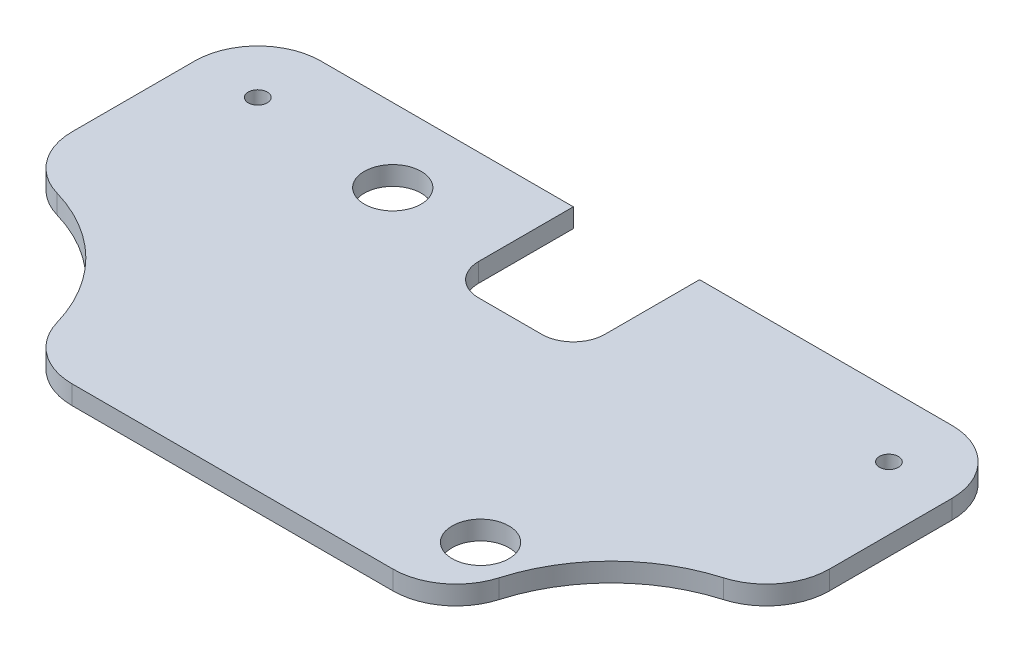
ISO-10303-21;
HEADER;
FILE_DESCRIPTION(('STEP AP214'),'2;1');
FILE_NAME('part.step','',(''),(''),'','','');
FILE_SCHEMA(('AUTOMOTIVE_DESIGN { 1 0 10303 214 1 1 1 1 }'));
ENDSEC;
DATA;
#1=APPLICATION_CONTEXT('core data for automotive mechanical design processes');
#2=APPLICATION_PROTOCOL_DEFINITION('international standard','automotive_design',2000,#1);
#3=PRODUCT_CONTEXT('',#1,'mechanical');
#4=PRODUCT('Part','Part','',(#3));
#5=PRODUCT_RELATED_PRODUCT_CATEGORY('part','',(#4));
#6=PRODUCT_DEFINITION_FORMATION('','',#4);
#7=PRODUCT_DEFINITION_CONTEXT('part definition',#1,'design');
#8=PRODUCT_DEFINITION('design','',#6,#7);
#9=PRODUCT_DEFINITION_SHAPE('','',#8);
#10=(LENGTH_UNIT() NAMED_UNIT(*) SI_UNIT(.MILLI.,.METRE.));
#11=(NAMED_UNIT(*) PLANE_ANGLE_UNIT() SI_UNIT($,.RADIAN.));
#12=(NAMED_UNIT(*) SI_UNIT($,.STERADIAN.) SOLID_ANGLE_UNIT());
#13=UNCERTAINTY_MEASURE_WITH_UNIT(LENGTH_MEASURE(1.E-05),#10,'distance_accuracy_value','');
#14=(GEOMETRIC_REPRESENTATION_CONTEXT(3) GLOBAL_UNCERTAINTY_ASSIGNED_CONTEXT((#13)) GLOBAL_UNIT_ASSIGNED_CONTEXT((#10,
#11,#12)) REPRESENTATION_CONTEXT('',''));
#15=CARTESIAN_POINT('',(0.,0.,0.));
#16=DIRECTION('',(0.,0.,1.));
#17=DIRECTION('',(1.,0.,0.));
#18=AXIS2_PLACEMENT_3D('',#15,#16,#17);
#19=CARTESIAN_POINT('',(-60.,3.,-32.));
#20=DIRECTION('',(0.,0.,1.));
#21=DIRECTION('',(1.,0.,0.));
#22=AXIS2_PLACEMENT_3D('',#19,#20,#21);
#23=PLANE('',#22);
#24=DIRECTION('',(-1.,0.,0.));
#25=VECTOR('',#24,1.);
#26=CARTESIAN_POINT('',(-60.,3.,-32.));
#27=LINE('',#26,#25);
#28=CARTESIAN_POINT('',(-9.99999999999999,3.,-32.));
#29=VERTEX_POINT('',#28);
#30=CARTESIAN_POINT('',(-50.,3.,-32.));
#31=VERTEX_POINT('',#30);
#32=EDGE_CURVE('E164',#29,#31,#27,.T.);
#33=ORIENTED_EDGE('',*,*,#32,.F.);
#34=DIRECTION('',(0.,-1.,0.));
#35=VECTOR('',#34,1.);
#36=CARTESIAN_POINT('',(-9.99999999999999,3.,-32.));
#37=LINE('',#36,#35);
#38=CARTESIAN_POINT('',(-9.99999999999999,0.,-32.));
#39=VERTEX_POINT('',#38);
#40=EDGE_CURVE('E176',#29,#39,#37,.T.);
#41=ORIENTED_EDGE('',*,*,#40,.T.);
#42=DIRECTION('',(-1.,0.,0.));
#43=VECTOR('',#42,1.);
#44=CARTESIAN_POINT('',(-60.,0.,-32.));
#45=LINE('',#44,#43);
#46=CARTESIAN_POINT('',(-50.,0.,-32.));
#47=VERTEX_POINT('',#46);
#48=EDGE_CURVE('E203',#39,#47,#45,.T.);
#49=ORIENTED_EDGE('',*,*,#48,.T.);
#50=DIRECTION('',(0.,-1.,0.));
#51=VECTOR('',#50,1.);
#52=CARTESIAN_POINT('',(-50.,3.,-32.));
#53=LINE('',#52,#51);
#54=EDGE_CURVE('E186',#47,#31,#53,.F.);
#55=ORIENTED_EDGE('',*,*,#54,.T.);
#56=EDGE_LOOP('',(#33,#41,#49,#55));
#57=FACE_BOUND('',#56,.T.);
#58=ADVANCED_FACE('F34',(#57),#23,.F.);
#59=CARTESIAN_POINT('',(60.,3.,32.));
#60=DIRECTION('',(-1.,0.,0.));
#61=DIRECTION('',(0.,0.,1.));
#62=AXIS2_PLACEMENT_3D('',#59,#60,#61);
#63=PLANE('',#62);
#64=DIRECTION('',(0.,0.,-1.));
#65=VECTOR('',#64,1.);
#66=CARTESIAN_POINT('',(60.,3.,32.));
#67=LINE('',#66,#65);
#68=CARTESIAN_POINT('',(60.,3.,-2.58323293158116));
#69=VERTEX_POINT('',#68);
#70=CARTESIAN_POINT('',(60.,3.,-22.));
#71=VERTEX_POINT('',#70);
#72=EDGE_CURVE('E189',#69,#71,#67,.T.);
#73=ORIENTED_EDGE('',*,*,#72,.F.);
#74=DIRECTION('',(0.,-1.,0.));
#75=VECTOR('',#74,1.);
#76=CARTESIAN_POINT('',(60.,3.,-2.58323293158116));
#77=LINE('',#76,#75);
#78=CARTESIAN_POINT('',(60.,0.,-2.58323293158116));
#79=VERTEX_POINT('',#78);
#80=EDGE_CURVE('E249',#69,#79,#77,.T.);
#81=ORIENTED_EDGE('',*,*,#80,.T.);
#82=DIRECTION('',(0.,0.,-1.));
#83=VECTOR('',#82,1.);
#84=CARTESIAN_POINT('',(60.,0.,32.));
#85=LINE('',#84,#83);
#86=CARTESIAN_POINT('',(60.,0.,-22.));
#87=VERTEX_POINT('',#86);
#88=EDGE_CURVE('E201',#79,#87,#85,.T.);
#89=ORIENTED_EDGE('',*,*,#88,.T.);
#90=DIRECTION('',(0.,-1.,0.));
#91=VECTOR('',#90,1.);
#92=CARTESIAN_POINT('',(60.,3.,-22.));
#93=LINE('',#92,#91);
#94=EDGE_CURVE('E223',#87,#71,#93,.F.);
#95=ORIENTED_EDGE('',*,*,#94,.T.);
#96=EDGE_LOOP('',(#73,#81,#89,#95));
#97=FACE_BOUND('',#96,.T.);
#98=ADVANCED_FACE('F342',(#97),#63,.F.);
#99=CARTESIAN_POINT('',(50.,0.,-32.));
#100=VERTEX_POINT('',#99);
#101=CARTESIAN_POINT('',(10.,0.,-32.));
#102=VERTEX_POINT('',#101);
#103=EDGE_CURVE('E205',#100,#102,#45,.T.);
#104=ORIENTED_EDGE('',*,*,#103,.T.);
#105=DIRECTION('',(0.,-1.,0.));
#106=VECTOR('',#105,1.);
#107=CARTESIAN_POINT('',(10.,3.,-32.));
#108=LINE('',#107,#106);
#109=CARTESIAN_POINT('',(10.,3.,-32.));
#110=VERTEX_POINT('',#109);
#111=EDGE_CURVE('E182',#110,#102,#108,.T.);
#112=ORIENTED_EDGE('',*,*,#111,.F.);
#113=CARTESIAN_POINT('',(50.,3.,-32.));
#114=VERTEX_POINT('',#113);
#115=EDGE_CURVE('E188',#114,#110,#27,.T.);
#116=ORIENTED_EDGE('',*,*,#115,.F.);
#117=DIRECTION('',(0.,-1.,0.));
#118=VECTOR('',#117,1.);
#119=CARTESIAN_POINT('',(50.,3.,-32.));
#120=LINE('',#119,#118);
#121=EDGE_CURVE('E214',#114,#100,#120,.T.);
#122=ORIENTED_EDGE('',*,*,#121,.T.);
#123=EDGE_LOOP('',(#104,#112,#116,#122));
#124=FACE_BOUND('',#123,.T.);
#125=ADVANCED_FACE('F344',(#124),#23,.F.);
#126=CARTESIAN_POINT('',(-60.,3.,32.));
#127=DIRECTION('',(1.,0.,0.));
#128=DIRECTION('',(0.,0.,-1.));
#129=AXIS2_PLACEMENT_3D('',#126,#127,#128);
#130=PLANE('',#129);
#131=DIRECTION('',(0.,0.,1.));
#132=VECTOR('',#131,1.);
#133=CARTESIAN_POINT('',(-60.,0.,32.));
#134=LINE('',#133,#132);
#135=CARTESIAN_POINT('',(-60.,0.,-22.));
#136=VERTEX_POINT('',#135);
#137=CARTESIAN_POINT('',(-60.,0.,-2.58323293158116));
#138=VERTEX_POINT('',#137);
#139=EDGE_CURVE('E208',#136,#138,#134,.T.);
#140=ORIENTED_EDGE('',*,*,#139,.T.);
#141=DIRECTION('',(0.,-1.,0.));
#142=VECTOR('',#141,1.);
#143=CARTESIAN_POINT('',(-60.,3.,-2.58323293158116));
#144=LINE('',#143,#142);
#145=CARTESIAN_POINT('',(-60.,3.,-2.58323293158116));
#146=VERTEX_POINT('',#145);
#147=EDGE_CURVE('E264',#138,#146,#144,.F.);
#148=ORIENTED_EDGE('',*,*,#147,.T.);
#149=DIRECTION('',(0.,0.,1.));
#150=VECTOR('',#149,1.);
#151=CARTESIAN_POINT('',(-60.,3.,32.));
#152=LINE('',#151,#150);
#153=CARTESIAN_POINT('',(-60.,3.,-22.));
#154=VERTEX_POINT('',#153);
#155=EDGE_CURVE('E192',#154,#146,#152,.T.);
#156=ORIENTED_EDGE('',*,*,#155,.F.);
#157=DIRECTION('',(0.,-1.,0.));
#158=VECTOR('',#157,1.);
#159=CARTESIAN_POINT('',(-60.,3.,-22.));
#160=LINE('',#159,#158);
#161=EDGE_CURVE('E230',#154,#136,#160,.T.);
#162=ORIENTED_EDGE('',*,*,#161,.T.);
#163=EDGE_LOOP('',(#140,#148,#156,#162));
#164=FACE_BOUND('',#163,.T.);
#165=ADVANCED_FACE('F336',(#164),#130,.F.);
#166=CARTESIAN_POINT('',(-60.,3.,32.));
#167=DIRECTION('',(0.,0.,-1.));
#168=DIRECTION('',(-1.,0.,0.));
#169=AXIS2_PLACEMENT_3D('',#166,#167,#168);
#170=PLANE('',#169);
#171=DIRECTION('',(1.,0.,0.));
#172=VECTOR('',#171,1.);
#173=CARTESIAN_POINT('',(-60.,0.,32.));
#174=LINE('',#173,#172);
#175=CARTESIAN_POINT('',(-25.4167670684188,0.,32.));
#176=VERTEX_POINT('',#175);
#177=CARTESIAN_POINT('',(25.4167670684188,0.,32.));
#178=VERTEX_POINT('',#177);
#179=EDGE_CURVE('E193',#176,#178,#174,.T.);
#180=ORIENTED_EDGE('',*,*,#179,.T.);
#181=DIRECTION('',(0.,-1.,0.));
#182=VECTOR('',#181,1.);
#183=CARTESIAN_POINT('',(25.4167670684188,3.,32.));
#184=LINE('',#183,#182);
#185=CARTESIAN_POINT('',(25.4167670684188,3.,32.));
#186=VERTEX_POINT('',#185);
#187=EDGE_CURVE('E272',#178,#186,#184,.F.);
#188=ORIENTED_EDGE('',*,*,#187,.T.);
#189=DIRECTION('',(1.,0.,0.));
#190=VECTOR('',#189,1.);
#191=CARTESIAN_POINT('',(-60.,3.,32.));
#192=LINE('',#191,#190);
#193=CARTESIAN_POINT('',(-25.4167670684188,3.,32.));
#194=VERTEX_POINT('',#193);
#195=EDGE_CURVE('E199',#194,#186,#192,.T.);
#196=ORIENTED_EDGE('',*,*,#195,.F.);
#197=DIRECTION('',(0.,-1.,0.));
#198=VECTOR('',#197,1.);
#199=CARTESIAN_POINT('',(-25.4167670684188,3.,32.));
#200=LINE('',#199,#198);
#201=EDGE_CURVE('E269',#194,#176,#200,.T.);
#202=ORIENTED_EDGE('',*,*,#201,.T.);
#203=EDGE_LOOP('',(#180,#188,#196,#202));
#204=FACE_BOUND('',#203,.T.);
#205=ADVANCED_FACE('F287',(#204),#170,.F.);
#206=CARTESIAN_POINT('',(0.,3.,0.));
#207=DIRECTION('',(0.,-1.,0.));
#208=DIRECTION('',(0.,0.,-1.));
#209=AXIS2_PLACEMENT_3D('',#206,#207,#208);
#210=PLANE('',#209);
#211=CARTESIAN_POINT('',(-26.921391454817,3.,-20.3095932567179));
#212=DIRECTION('',(0.,-1.,0.));
#213=DIRECTION('',(0.,0.,-1.));
#214=AXIS2_PLACEMENT_3D('',#211,#212,#213);
#215=CIRCLE('',#214,4.5);
#216=CARTESIAN_POINT('',(-26.921391454817,3.,-24.8095932567179));
#217=VERTEX_POINT('',#216);
#218=EDGE_CURVE('E299',#217,#217,#215,.T.);
#219=ORIENTED_EDGE('',*,*,#218,.T.);
#220=EDGE_LOOP('',(#219));
#221=FACE_BOUND('',#220,.T.);
#222=CARTESIAN_POINT('',(28.6833041627338,3.,21.3841451853975));
#223=DIRECTION('',(0.,-1.,0.));
#224=DIRECTION('',(0.,0.,-1.));
#225=AXIS2_PLACEMENT_3D('',#222,#223,#224);
#226=CIRCLE('',#225,4.5);
#227=CARTESIAN_POINT('',(28.6833041627338,3.,16.8841451853975));
#228=VERTEX_POINT('',#227);
#229=EDGE_CURVE('E398',#228,#228,#226,.T.);
#230=ORIENTED_EDGE('',*,*,#229,.T.);
#231=EDGE_LOOP('',(#230));
#232=FACE_BOUND('',#231,.T.);
#233=CARTESIAN_POINT('',(-50.,3.,-22.));
#234=DIRECTION('',(0.,1.,0.));
#235=DIRECTION('',(0.,0.,1.));
#236=AXIS2_PLACEMENT_3D('',#233,#234,#235);
#237=CIRCLE('',#236,1.5);
#238=CARTESIAN_POINT('',(-50.,3.,-20.5));
#239=VERTEX_POINT('',#238);
#240=EDGE_CURVE('E316',#239,#239,#237,.T.);
#241=ORIENTED_EDGE('',*,*,#240,.F.);
#242=EDGE_LOOP('',(#241));
#243=FACE_BOUND('',#242,.T.);
#244=CARTESIAN_POINT('',(50.,3.,-22.));
#245=DIRECTION('',(0.,1.,0.));
#246=DIRECTION('',(0.,0.,-1.));
#247=AXIS2_PLACEMENT_3D('',#244,#245,#246);
#248=CIRCLE('',#247,1.5);
#249=CARTESIAN_POINT('',(50.,3.,-23.5));
#250=VERTEX_POINT('',#249);
#251=EDGE_CURVE('E312',#250,#250,#248,.T.);
#252=ORIENTED_EDGE('',*,*,#251,.F.);
#253=EDGE_LOOP('',(#252));
#254=FACE_BOUND('',#253,.T.);
#255=ORIENTED_EDGE('',*,*,#195,.T.);
#256=CARTESIAN_POINT('',(25.4167670684188,3.,22.));
#257=DIRECTION('',(0.,-1.,0.));
#258=DIRECTION('',(0.,0.,-1.));
#259=AXIS2_PLACEMENT_3D('',#256,#257,#258);
#260=CIRCLE('',#259,10.);
#261=CARTESIAN_POINT('',(35.0232206605247,3.,24.7777777777778));
#262=VERTEX_POINT('',#261);
#263=EDGE_CURVE('E277',#186,#262,#260,.F.);
#264=ORIENTED_EDGE('',*,*,#263,.T.);
#265=CARTESIAN_POINT('',(60.,3.,32.));
#266=DIRECTION('',(0.,-1.,0.));
#267=DIRECTION('',(0.,0.,1.));
#268=AXIS2_PLACEMENT_3D('',#265,#266,#267);
#269=CIRCLE('',#268,26.);
#270=CARTESIAN_POINT('',(52.7777777777778,3.,7.02322066052472));
#271=VERTEX_POINT('',#270);
#272=EDGE_CURVE('E291',#262,#271,#269,.T.);
#273=ORIENTED_EDGE('',*,*,#272,.T.);
#274=CARTESIAN_POINT('',(50.,3.,-2.58323293158116));
#275=DIRECTION('',(0.,-1.,0.));
#276=DIRECTION('',(0.,0.,-1.));
#277=AXIS2_PLACEMENT_3D('',#274,#275,#276);
#278=CIRCLE('',#277,10.);
#279=EDGE_CURVE('E262',#271,#69,#278,.F.);
#280=ORIENTED_EDGE('',*,*,#279,.T.);
#281=ORIENTED_EDGE('',*,*,#72,.T.);
#282=CARTESIAN_POINT('',(50.,3.,-22.));
#283=DIRECTION('',(0.,-1.,0.));
#284=DIRECTION('',(0.,0.,-1.));
#285=AXIS2_PLACEMENT_3D('',#282,#283,#284);
#286=CIRCLE('',#285,10.);
#287=EDGE_CURVE('E228',#71,#114,#286,.F.);
#288=ORIENTED_EDGE('',*,*,#287,.T.);
#289=ORIENTED_EDGE('',*,*,#115,.T.);
#290=DIRECTION('',(0.,0.,1.));
#291=VECTOR('',#290,1.);
#292=CARTESIAN_POINT('',(10.,3.,-32.));
#293=LINE('',#292,#291);
#294=CARTESIAN_POINT('',(10.,3.,-17.));
#295=VERTEX_POINT('',#294);
#296=EDGE_CURVE('E172',#110,#295,#293,.T.);
#297=ORIENTED_EDGE('',*,*,#296,.T.);
#298=CARTESIAN_POINT('',(5.00000000000001,3.,-17.));
#299=DIRECTION('',(0.,-1.,0.));
#300=DIRECTION('',(0.,0.,-1.));
#301=AXIS2_PLACEMENT_3D('',#298,#299,#300);
#302=CIRCLE('',#301,5.);
#303=CARTESIAN_POINT('',(5.00000000000001,3.,-12.));
#304=VERTEX_POINT('',#303);
#305=EDGE_CURVE('E244',#295,#304,#302,.T.);
#306=ORIENTED_EDGE('',*,*,#305,.T.);
#307=DIRECTION('',(-1.,0.,0.));
#308=VECTOR('',#307,1.);
#309=CARTESIAN_POINT('',(-10.,3.,-12.));
#310=LINE('',#309,#308);
#311=CARTESIAN_POINT('',(-5.,3.,-12.));
#312=VERTEX_POINT('',#311);
#313=EDGE_CURVE('E183',#304,#312,#310,.T.);
#314=ORIENTED_EDGE('',*,*,#313,.T.);
#315=CARTESIAN_POINT('',(-5.,3.,-17.));
#316=DIRECTION('',(0.,-1.,0.));
#317=DIRECTION('',(0.,0.,-1.));
#318=AXIS2_PLACEMENT_3D('',#315,#316,#317);
#319=CIRCLE('',#318,5.);
#320=CARTESIAN_POINT('',(-10.,3.,-17.));
#321=VERTEX_POINT('',#320);
#322=EDGE_CURVE('E168',#312,#321,#319,.T.);
#323=ORIENTED_EDGE('',*,*,#322,.T.);
#324=DIRECTION('',(0.,0.,-1.));
#325=VECTOR('',#324,1.);
#326=CARTESIAN_POINT('',(-9.99999999999999,3.,-32.));
#327=LINE('',#326,#325);
#328=EDGE_CURVE('E159',#321,#29,#327,.T.);
#329=ORIENTED_EDGE('',*,*,#328,.T.);
#330=ORIENTED_EDGE('',*,*,#32,.T.);
#331=CARTESIAN_POINT('',(-50.,3.,-22.));
#332=DIRECTION('',(0.,-1.,0.));
#333=DIRECTION('',(0.,0.,-1.));
#334=AXIS2_PLACEMENT_3D('',#331,#332,#333);
#335=CIRCLE('',#334,10.);
#336=EDGE_CURVE('E226',#31,#154,#335,.F.);
#337=ORIENTED_EDGE('',*,*,#336,.T.);
#338=ORIENTED_EDGE('',*,*,#155,.T.);
#339=CARTESIAN_POINT('',(-50.,3.,-2.58323293158116));
#340=DIRECTION('',(0.,-1.,0.));
#341=DIRECTION('',(0.,0.,-1.));
#342=AXIS2_PLACEMENT_3D('',#339,#340,#341);
#343=CIRCLE('',#342,10.);
#344=CARTESIAN_POINT('',(-52.7777777777778,3.,7.02322066052472));
#345=VERTEX_POINT('',#344);
#346=EDGE_CURVE('E260',#146,#345,#343,.F.);
#347=ORIENTED_EDGE('',*,*,#346,.T.);
#348=CARTESIAN_POINT('',(-60.,3.,32.));
#349=DIRECTION('',(0.,-1.,0.));
#350=DIRECTION('',(0.,0.,-1.));
#351=AXIS2_PLACEMENT_3D('',#348,#349,#350);
#352=CIRCLE('',#351,26.);
#353=CARTESIAN_POINT('',(-35.0232206605247,3.,24.7777777777778));
#354=VERTEX_POINT('',#353);
#355=EDGE_CURVE('E297',#345,#354,#352,.T.);
#356=ORIENTED_EDGE('',*,*,#355,.T.);
#357=CARTESIAN_POINT('',(-25.4167670684188,3.,22.));
#358=DIRECTION('',(0.,-1.,0.));
#359=DIRECTION('',(0.,0.,-1.));
#360=AXIS2_PLACEMENT_3D('',#357,#358,#359);
#361=CIRCLE('',#360,10.);
#362=EDGE_CURVE('E275',#354,#194,#361,.F.);
#363=ORIENTED_EDGE('',*,*,#362,.T.);
#364=EDGE_LOOP('',(#255,#264,#273,#280,#281,#288,#289,#297,#306,#314,#323,#329,#330,#337,#338,
#347,#356,#363));
#365=FACE_BOUND('',#364,.T.);
#366=ADVANCED_FACE('F162',(#221,#232,#243,#254,#365),#210,.F.);
#367=CARTESIAN_POINT('',(0.,0.,0.));
#368=DIRECTION('',(0.,-1.,0.));
#369=DIRECTION('',(0.,0.,-1.));
#370=AXIS2_PLACEMENT_3D('',#367,#368,#369);
#371=PLANE('',#370);
#372=CARTESIAN_POINT('',(-26.921391454817,0.,-20.3095932567179));
#373=DIRECTION('',(0.,-1.,0.));
#374=DIRECTION('',(0.,0.,-1.));
#375=AXIS2_PLACEMENT_3D('',#372,#373,#374);
#376=CIRCLE('',#375,4.5);
#377=CARTESIAN_POINT('',(-26.921391454817,0.,-24.8095932567179));
#378=VERTEX_POINT('',#377);
#379=EDGE_CURVE('E401',#378,#378,#376,.T.);
#380=ORIENTED_EDGE('',*,*,#379,.F.);
#381=EDGE_LOOP('',(#380));
#382=FACE_BOUND('',#381,.T.);
#383=CARTESIAN_POINT('',(28.6833041627338,0.,21.3841451853975));
#384=DIRECTION('',(0.,-1.,0.));
#385=DIRECTION('',(0.,0.,-1.));
#386=AXIS2_PLACEMENT_3D('',#383,#384,#385);
#387=CIRCLE('',#386,4.5);
#388=CARTESIAN_POINT('',(28.6833041627338,0.,16.8841451853975));
#389=VERTEX_POINT('',#388);
#390=EDGE_CURVE('E395',#389,#389,#387,.T.);
#391=ORIENTED_EDGE('',*,*,#390,.F.);
#392=EDGE_LOOP('',(#391));
#393=FACE_BOUND('',#392,.T.);
#394=CARTESIAN_POINT('',(60.,0.,32.));
#395=DIRECTION('',(0.,-1.,0.));
#396=DIRECTION('',(0.,0.,1.));
#397=AXIS2_PLACEMENT_3D('',#394,#395,#396);
#398=CIRCLE('',#397,26.);
#399=CARTESIAN_POINT('',(35.0232206605247,0.,24.7777777777778));
#400=VERTEX_POINT('',#399);
#401=CARTESIAN_POINT('',(52.7777777777778,0.,7.02322066052472));
#402=VERTEX_POINT('',#401);
#403=EDGE_CURVE('E283',#400,#402,#398,.T.);
#404=ORIENTED_EDGE('',*,*,#403,.F.);
#405=CARTESIAN_POINT('',(25.4167670684188,0.,22.));
#406=DIRECTION('',(0.,-1.,0.));
#407=DIRECTION('',(0.,0.,-1.));
#408=AXIS2_PLACEMENT_3D('',#405,#406,#407);
#409=CIRCLE('',#408,10.);
#410=EDGE_CURVE('E42',#400,#178,#409,.T.);
#411=ORIENTED_EDGE('',*,*,#410,.T.);
#412=ORIENTED_EDGE('',*,*,#179,.F.);
#413=CARTESIAN_POINT('',(-25.4167670684188,0.,22.));
#414=DIRECTION('',(0.,-1.,0.));
#415=DIRECTION('',(0.,0.,-1.));
#416=AXIS2_PLACEMENT_3D('',#413,#414,#415);
#417=CIRCLE('',#416,10.);
#418=CARTESIAN_POINT('',(-35.0232206605247,0.,24.7777777777778));
#419=VERTEX_POINT('',#418);
#420=EDGE_CURVE('E49',#176,#419,#417,.T.);
#421=ORIENTED_EDGE('',*,*,#420,.T.);
#422=CARTESIAN_POINT('',(-60.,0.,32.));
#423=DIRECTION('',(0.,-1.,0.));
#424=DIRECTION('',(0.,0.,-1.));
#425=AXIS2_PLACEMENT_3D('',#422,#423,#424);
#426=CIRCLE('',#425,26.);
#427=CARTESIAN_POINT('',(-52.7777777777778,0.,7.02322066052472));
#428=VERTEX_POINT('',#427);
#429=EDGE_CURVE('E295',#428,#419,#426,.T.);
#430=ORIENTED_EDGE('',*,*,#429,.F.);
#431=CARTESIAN_POINT('',(-50.,0.,-2.58323293158116));
#432=DIRECTION('',(0.,-1.,0.));
#433=DIRECTION('',(0.,0.,-1.));
#434=AXIS2_PLACEMENT_3D('',#431,#432,#433);
#435=CIRCLE('',#434,10.);
#436=EDGE_CURVE('E252',#428,#138,#435,.T.);
#437=ORIENTED_EDGE('',*,*,#436,.T.);
#438=ORIENTED_EDGE('',*,*,#139,.F.);
#439=CARTESIAN_POINT('',(-50.,0.,-22.));
#440=DIRECTION('',(0.,-1.,0.));
#441=DIRECTION('',(0.,0.,-1.));
#442=AXIS2_PLACEMENT_3D('',#439,#440,#441);
#443=CIRCLE('',#442,10.);
#444=EDGE_CURVE('E217',#136,#47,#443,.T.);
#445=ORIENTED_EDGE('',*,*,#444,.T.);
#446=ORIENTED_EDGE('',*,*,#48,.F.);
#447=DIRECTION('',(0.,0.,-1.));
#448=VECTOR('',#447,1.);
#449=CARTESIAN_POINT('',(-9.99999999999999,0.,-32.));
#450=LINE('',#449,#448);
#451=CARTESIAN_POINT('',(-10.,0.,-17.));
#452=VERTEX_POINT('',#451);
#453=EDGE_CURVE('E179',#452,#39,#450,.T.);
#454=ORIENTED_EDGE('',*,*,#453,.F.);
#455=CARTESIAN_POINT('',(-5.,0.,-17.));
#456=DIRECTION('',(0.,-1.,0.));
#457=DIRECTION('',(0.,0.,-1.));
#458=AXIS2_PLACEMENT_3D('',#455,#456,#457);
#459=CIRCLE('',#458,5.);
#460=CARTESIAN_POINT('',(-5.,0.,-12.));
#461=VERTEX_POINT('',#460);
#462=EDGE_CURVE('E246',#452,#461,#459,.F.);
#463=ORIENTED_EDGE('',*,*,#462,.T.);
#464=DIRECTION('',(-1.,0.,0.));
#465=VECTOR('',#464,1.);
#466=CARTESIAN_POINT('',(-10.,0.,-12.));
#467=LINE('',#466,#465);
#468=CARTESIAN_POINT('',(5.00000000000001,0.,-12.));
#469=VERTEX_POINT('',#468);
#470=EDGE_CURVE('E173',#469,#461,#467,.T.);
#471=ORIENTED_EDGE('',*,*,#470,.F.);
#472=CARTESIAN_POINT('',(5.00000000000001,0.,-17.));
#473=DIRECTION('',(0.,-1.,0.));
#474=DIRECTION('',(0.,0.,-1.));
#475=AXIS2_PLACEMENT_3D('',#472,#473,#474);
#476=CIRCLE('',#475,5.);
#477=CARTESIAN_POINT('',(10.,0.,-17.));
#478=VERTEX_POINT('',#477);
#479=EDGE_CURVE('E242',#469,#478,#476,.F.);
#480=ORIENTED_EDGE('',*,*,#479,.T.);
#481=DIRECTION('',(0.,0.,1.));
#482=VECTOR('',#481,1.);
#483=CARTESIAN_POINT('',(10.,0.,-32.));
#484=LINE('',#483,#482);
#485=EDGE_CURVE('E307',#102,#478,#484,.T.);
#486=ORIENTED_EDGE('',*,*,#485,.F.);
#487=ORIENTED_EDGE('',*,*,#103,.F.);
#488=CARTESIAN_POINT('',(50.,0.,-22.));
#489=DIRECTION('',(0.,-1.,0.));
#490=DIRECTION('',(0.,0.,-1.));
#491=AXIS2_PLACEMENT_3D('',#488,#489,#490);
#492=CIRCLE('',#491,10.);
#493=EDGE_CURVE('E220',#100,#87,#492,.T.);
#494=ORIENTED_EDGE('',*,*,#493,.T.);
#495=ORIENTED_EDGE('',*,*,#88,.F.);
#496=CARTESIAN_POINT('',(50.,0.,-2.58323293158116));
#497=DIRECTION('',(0.,-1.,0.));
#498=DIRECTION('',(0.,0.,-1.));
#499=AXIS2_PLACEMENT_3D('',#496,#497,#498);
#500=CIRCLE('',#499,10.);
#501=EDGE_CURVE('E254',#79,#402,#500,.T.);
#502=ORIENTED_EDGE('',*,*,#501,.T.);
#503=EDGE_LOOP('',(#404,#411,#412,#421,#430,#437,#438,#445,#446,#454,#463,#471,#480,#486,#487,
#494,#495,#502));
#504=FACE_BOUND('',#503,.T.);
#505=CARTESIAN_POINT('',(-50.,0.,-22.));
#506=DIRECTION('',(0.,1.,0.));
#507=DIRECTION('',(0.,0.,1.));
#508=AXIS2_PLACEMENT_3D('',#505,#506,#507);
#509=CIRCLE('',#508,1.5);
#510=CARTESIAN_POINT('',(-50.,0.,-20.5));
#511=VERTEX_POINT('',#510);
#512=EDGE_CURVE('E204',#511,#511,#509,.T.);
#513=ORIENTED_EDGE('',*,*,#512,.T.);
#514=EDGE_LOOP('',(#513));
#515=FACE_BOUND('',#514,.T.);
#516=CARTESIAN_POINT('',(50.,0.,-22.));
#517=DIRECTION('',(0.,1.,0.));
#518=DIRECTION('',(0.,0.,-1.));
#519=AXIS2_PLACEMENT_3D('',#516,#517,#518);
#520=CIRCLE('',#519,1.5);
#521=CARTESIAN_POINT('',(50.,0.,-23.5));
#522=VERTEX_POINT('',#521);
#523=EDGE_CURVE('E319',#522,#522,#520,.T.);
#524=ORIENTED_EDGE('',*,*,#523,.T.);
#525=EDGE_LOOP('',(#524));
#526=FACE_BOUND('',#525,.T.);
#527=ADVANCED_FACE('F281',(#382,#393,#504,#515,#526),#371,.T.);
#528=CARTESIAN_POINT('',(50.,0.,-22.));
#529=DIRECTION('',(0.,1.,0.));
#530=DIRECTION('',(0.,0.,1.));
#531=AXIS2_PLACEMENT_3D('',#528,#529,#530);
#532=CYLINDRICAL_SURFACE('',#531,1.5);
#533=ORIENTED_EDGE('',*,*,#523,.F.);
#534=EDGE_LOOP('',(#533));
#535=FACE_BOUND('',#534,.T.);
#536=ORIENTED_EDGE('',*,*,#251,.T.);
#537=EDGE_LOOP('',(#536));
#538=FACE_BOUND('',#537,.T.);
#539=ADVANCED_FACE('F324',(#535,#538),#532,.F.);
#540=CARTESIAN_POINT('',(-50.,0.,-22.));
#541=DIRECTION('',(0.,1.,0.));
#542=DIRECTION('',(0.,0.,1.));
#543=AXIS2_PLACEMENT_3D('',#540,#541,#542);
#544=CYLINDRICAL_SURFACE('',#543,1.5);
#545=ORIENTED_EDGE('',*,*,#512,.F.);
#546=EDGE_LOOP('',(#545));
#547=FACE_BOUND('',#546,.T.);
#548=ORIENTED_EDGE('',*,*,#240,.T.);
#549=EDGE_LOOP('',(#548));
#550=FACE_BOUND('',#549,.T.);
#551=ADVANCED_FACE('F434',(#547,#550),#544,.F.);
#552=CARTESIAN_POINT('',(50.,3.,-22.));
#553=DIRECTION('',(0.,-1.,0.));
#554=DIRECTION('',(0.,0.,-1.));
#555=AXIS2_PLACEMENT_3D('',#552,#553,#554);
#556=CYLINDRICAL_SURFACE('',#555,10.);
#557=ORIENTED_EDGE('',*,*,#287,.F.);
#558=ORIENTED_EDGE('',*,*,#94,.F.);
#559=ORIENTED_EDGE('',*,*,#493,.F.);
#560=ORIENTED_EDGE('',*,*,#121,.F.);
#561=EDGE_LOOP('',(#557,#558,#559,#560));
#562=FACE_BOUND('',#561,.T.);
#563=ADVANCED_FACE('F436',(#562),#556,.T.);
#564=CARTESIAN_POINT('',(-50.,3.,-22.));
#565=DIRECTION('',(0.,-1.,0.));
#566=DIRECTION('',(0.,0.,-1.));
#567=AXIS2_PLACEMENT_3D('',#564,#565,#566);
#568=CYLINDRICAL_SURFACE('',#567,10.);
#569=ORIENTED_EDGE('',*,*,#336,.F.);
#570=ORIENTED_EDGE('',*,*,#54,.F.);
#571=ORIENTED_EDGE('',*,*,#444,.F.);
#572=ORIENTED_EDGE('',*,*,#161,.F.);
#573=EDGE_LOOP('',(#569,#570,#571,#572));
#574=FACE_BOUND('',#573,.T.);
#575=ADVANCED_FACE('F381',(#574),#568,.T.);
#576=CARTESIAN_POINT('',(-9.99999999999999,3.,-32.));
#577=DIRECTION('',(-1.,0.,0.));
#578=DIRECTION('',(0.,0.,1.));
#579=AXIS2_PLACEMENT_3D('',#576,#577,#578);
#580=PLANE('',#579);
#581=ORIENTED_EDGE('',*,*,#328,.F.);
#582=DIRECTION('',(0.,-1.,0.));
#583=VECTOR('',#582,1.);
#584=CARTESIAN_POINT('',(-10.,0.,-17.));
#585=LINE('',#584,#583);
#586=EDGE_CURVE('E240',#321,#452,#585,.T.);
#587=ORIENTED_EDGE('',*,*,#586,.T.);
#588=ORIENTED_EDGE('',*,*,#453,.T.);
#589=ORIENTED_EDGE('',*,*,#40,.F.);
#590=EDGE_LOOP('',(#581,#587,#588,#589));
#591=FACE_BOUND('',#590,.T.);
#592=ADVANCED_FACE('F177',(#591),#580,.F.);
#593=CARTESIAN_POINT('',(-10.,3.,-12.));
#594=DIRECTION('',(0.,0.,1.));
#595=DIRECTION('',(1.,0.,0.));
#596=AXIS2_PLACEMENT_3D('',#593,#594,#595);
#597=PLANE('',#596);
#598=ORIENTED_EDGE('',*,*,#313,.F.);
#599=DIRECTION('',(0.,-1.,0.));
#600=VECTOR('',#599,1.);
#601=CARTESIAN_POINT('',(5.00000000000001,0.,-12.));
#602=LINE('',#601,#600);
#603=EDGE_CURVE('E235',#304,#469,#602,.T.);
#604=ORIENTED_EDGE('',*,*,#603,.T.);
#605=ORIENTED_EDGE('',*,*,#470,.T.);
#606=DIRECTION('',(0.,-1.,0.));
#607=VECTOR('',#606,1.);
#608=CARTESIAN_POINT('',(-5.,3.,-12.));
#609=LINE('',#608,#607);
#610=EDGE_CURVE('E233',#461,#312,#609,.F.);
#611=ORIENTED_EDGE('',*,*,#610,.T.);
#612=EDGE_LOOP('',(#598,#604,#605,#611));
#613=FACE_BOUND('',#612,.T.);
#614=ADVANCED_FACE('F374',(#613),#597,.F.);
#615=CARTESIAN_POINT('',(10.,3.,-32.));
#616=DIRECTION('',(1.,0.,0.));
#617=DIRECTION('',(0.,0.,-1.));
#618=AXIS2_PLACEMENT_3D('',#615,#616,#617);
#619=PLANE('',#618);
#620=ORIENTED_EDGE('',*,*,#485,.T.);
#621=DIRECTION('',(0.,-1.,0.));
#622=VECTOR('',#621,1.);
#623=CARTESIAN_POINT('',(10.,3.,-17.));
#624=LINE('',#623,#622);
#625=EDGE_CURVE('E238',#478,#295,#624,.F.);
#626=ORIENTED_EDGE('',*,*,#625,.T.);
#627=ORIENTED_EDGE('',*,*,#296,.F.);
#628=ORIENTED_EDGE('',*,*,#111,.T.);
#629=EDGE_LOOP('',(#620,#626,#627,#628));
#630=FACE_BOUND('',#629,.T.);
#631=ADVANCED_FACE('F367',(#630),#619,.F.);
#632=CARTESIAN_POINT('',(60.,3.,32.));
#633=DIRECTION('',(0.,-1.,0.));
#634=DIRECTION('',(0.,0.,-1.));
#635=AXIS2_PLACEMENT_3D('',#632,#633,#634);
#636=CYLINDRICAL_SURFACE('',#635,26.);
#637=ORIENTED_EDGE('',*,*,#272,.F.);
#638=DIRECTION('',(0.,-1.,0.));
#639=VECTOR('',#638,1.);
#640=CARTESIAN_POINT('',(35.0232206605247,3.,24.7777777777778));
#641=LINE('',#640,#639);
#642=EDGE_CURVE('E57',#262,#400,#641,.T.);
#643=ORIENTED_EDGE('',*,*,#642,.T.);
#644=ORIENTED_EDGE('',*,*,#403,.T.);
#645=DIRECTION('',(0.,-1.,0.));
#646=VECTOR('',#645,1.);
#647=CARTESIAN_POINT('',(52.7777777777778,3.,7.02322066052472));
#648=LINE('',#647,#646);
#649=EDGE_CURVE('E257',#402,#271,#648,.F.);
#650=ORIENTED_EDGE('',*,*,#649,.T.);
#651=EDGE_LOOP('',(#637,#643,#644,#650));
#652=FACE_BOUND('',#651,.T.);
#653=ADVANCED_FACE('F292',(#652),#636,.F.);
#654=CARTESIAN_POINT('',(-60.,3.,32.));
#655=DIRECTION('',(0.,-1.,0.));
#656=DIRECTION('',(0.,0.,-1.));
#657=AXIS2_PLACEMENT_3D('',#654,#655,#656);
#658=CYLINDRICAL_SURFACE('',#657,26.);
#659=ORIENTED_EDGE('',*,*,#429,.T.);
#660=DIRECTION('',(0.,-1.,0.));
#661=VECTOR('',#660,1.);
#662=CARTESIAN_POINT('',(-35.0232206605247,3.,24.7777777777778));
#663=LINE('',#662,#661);
#664=EDGE_CURVE('E11',#419,#354,#663,.F.);
#665=ORIENTED_EDGE('',*,*,#664,.T.);
#666=ORIENTED_EDGE('',*,*,#355,.F.);
#667=DIRECTION('',(0.,-1.,0.));
#668=VECTOR('',#667,1.);
#669=CARTESIAN_POINT('',(-52.7777777777778,3.,7.02322066052472));
#670=LINE('',#669,#668);
#671=EDGE_CURVE('E267',#345,#428,#670,.T.);
#672=ORIENTED_EDGE('',*,*,#671,.T.);
#673=EDGE_LOOP('',(#659,#665,#666,#672));
#674=FACE_BOUND('',#673,.T.);
#675=ADVANCED_FACE('F392',(#674),#658,.F.);
#676=CARTESIAN_POINT('',(5.00000000000001,3.,-17.));
#677=DIRECTION('',(0.,1.,0.));
#678=DIRECTION('',(0.,0.,1.));
#679=AXIS2_PLACEMENT_3D('',#676,#677,#678);
#680=CYLINDRICAL_SURFACE('',#679,5.);
#681=ORIENTED_EDGE('',*,*,#305,.F.);
#682=ORIENTED_EDGE('',*,*,#625,.F.);
#683=ORIENTED_EDGE('',*,*,#479,.F.);
#684=ORIENTED_EDGE('',*,*,#603,.F.);
#685=EDGE_LOOP('',(#681,#682,#683,#684));
#686=FACE_BOUND('',#685,.T.);
#687=ADVANCED_FACE('F370',(#686),#680,.F.);
#688=CARTESIAN_POINT('',(-5.,3.,-17.));
#689=DIRECTION('',(0.,1.,0.));
#690=DIRECTION('',(0.,0.,1.));
#691=AXIS2_PLACEMENT_3D('',#688,#689,#690);
#692=CYLINDRICAL_SURFACE('',#691,5.);
#693=ORIENTED_EDGE('',*,*,#322,.F.);
#694=ORIENTED_EDGE('',*,*,#610,.F.);
#695=ORIENTED_EDGE('',*,*,#462,.F.);
#696=ORIENTED_EDGE('',*,*,#586,.F.);
#697=EDGE_LOOP('',(#693,#694,#695,#696));
#698=FACE_BOUND('',#697,.T.);
#699=ADVANCED_FACE('F377',(#698),#692,.F.);
#700=CARTESIAN_POINT('',(50.,3.,-2.58323293158116));
#701=DIRECTION('',(0.,-1.,0.));
#702=DIRECTION('',(0.,0.,-1.));
#703=AXIS2_PLACEMENT_3D('',#700,#701,#702);
#704=CYLINDRICAL_SURFACE('',#703,10.);
#705=ORIENTED_EDGE('',*,*,#279,.F.);
#706=ORIENTED_EDGE('',*,*,#649,.F.);
#707=ORIENTED_EDGE('',*,*,#501,.F.);
#708=ORIENTED_EDGE('',*,*,#80,.F.);
#709=EDGE_LOOP('',(#705,#706,#707,#708));
#710=FACE_BOUND('',#709,.T.);
#711=ADVANCED_FACE('F498',(#710),#704,.T.);
#712=CARTESIAN_POINT('',(-50.,3.,-2.58323293158116));
#713=DIRECTION('',(0.,-1.,0.));
#714=DIRECTION('',(0.,0.,-1.));
#715=AXIS2_PLACEMENT_3D('',#712,#713,#714);
#716=CYLINDRICAL_SURFACE('',#715,10.);
#717=ORIENTED_EDGE('',*,*,#436,.F.);
#718=ORIENTED_EDGE('',*,*,#671,.F.);
#719=ORIENTED_EDGE('',*,*,#346,.F.);
#720=ORIENTED_EDGE('',*,*,#147,.F.);
#721=EDGE_LOOP('',(#717,#718,#719,#720));
#722=FACE_BOUND('',#721,.T.);
#723=ADVANCED_FACE('F386',(#722),#716,.T.);
#724=CARTESIAN_POINT('',(25.4167670684188,3.,22.));
#725=DIRECTION('',(0.,-1.,0.));
#726=DIRECTION('',(0.,0.,-1.));
#727=AXIS2_PLACEMENT_3D('',#724,#725,#726);
#728=CYLINDRICAL_SURFACE('',#727,10.);
#729=ORIENTED_EDGE('',*,*,#410,.F.);
#730=ORIENTED_EDGE('',*,*,#642,.F.);
#731=ORIENTED_EDGE('',*,*,#263,.F.);
#732=ORIENTED_EDGE('',*,*,#187,.F.);
#733=EDGE_LOOP('',(#729,#730,#731,#732));
#734=FACE_BOUND('',#733,.T.);
#735=ADVANCED_FACE('F290',(#734),#728,.T.);
#736=CARTESIAN_POINT('',(-25.4167670684188,3.,22.));
#737=DIRECTION('',(0.,-1.,0.));
#738=DIRECTION('',(0.,0.,-1.));
#739=AXIS2_PLACEMENT_3D('',#736,#737,#738);
#740=CYLINDRICAL_SURFACE('',#739,10.);
#741=ORIENTED_EDGE('',*,*,#362,.F.);
#742=ORIENTED_EDGE('',*,*,#664,.F.);
#743=ORIENTED_EDGE('',*,*,#420,.F.);
#744=ORIENTED_EDGE('',*,*,#201,.F.);
#745=EDGE_LOOP('',(#741,#742,#743,#744));
#746=FACE_BOUND('',#745,.T.);
#747=ADVANCED_FACE('F36',(#746),#740,.T.);
#748=CARTESIAN_POINT('',(28.6833041627338,3.,21.3841451853975));
#749=DIRECTION('',(0.,-1.,0.));
#750=DIRECTION('',(0.,0.,-1.));
#751=AXIS2_PLACEMENT_3D('',#748,#749,#750);
#752=CYLINDRICAL_SURFACE('',#751,4.5);
#753=ORIENTED_EDGE('',*,*,#229,.F.);
#754=EDGE_LOOP('',(#753));
#755=FACE_BOUND('',#754,.T.);
#756=ORIENTED_EDGE('',*,*,#390,.T.);
#757=EDGE_LOOP('',(#756));
#758=FACE_BOUND('',#757,.T.);
#759=ADVANCED_FACE('F409',(#755,#758),#752,.F.);
#760=CARTESIAN_POINT('',(-26.921391454817,3.,-20.3095932567179));
#761=DIRECTION('',(0.,-1.,0.));
#762=DIRECTION('',(0.,0.,-1.));
#763=AXIS2_PLACEMENT_3D('',#760,#761,#762);
#764=CYLINDRICAL_SURFACE('',#763,4.5);
#765=ORIENTED_EDGE('',*,*,#218,.F.);
#766=EDGE_LOOP('',(#765));
#767=FACE_BOUND('',#766,.T.);
#768=ORIENTED_EDGE('',*,*,#379,.T.);
#769=EDGE_LOOP('',(#768));
#770=FACE_BOUND('',#769,.T.);
#771=ADVANCED_FACE('F406',(#767,#770),#764,.F.);
#772=CLOSED_SHELL('',(#58,#98,#125,#165,#205,#366,#527,#539,#551,#563,#575,#592,#614,#631,#653,
#675,#687,#699,#711,#723,#735,#747,#759,#771));
#773=MANIFOLD_SOLID_BREP('B2',#772);
#774=ADVANCED_BREP_SHAPE_REPRESENTATION('',(#18,#773),#14);
#775=SHAPE_DEFINITION_REPRESENTATION(#9,#774);
ENDSEC;
END-ISO-10303-21;
